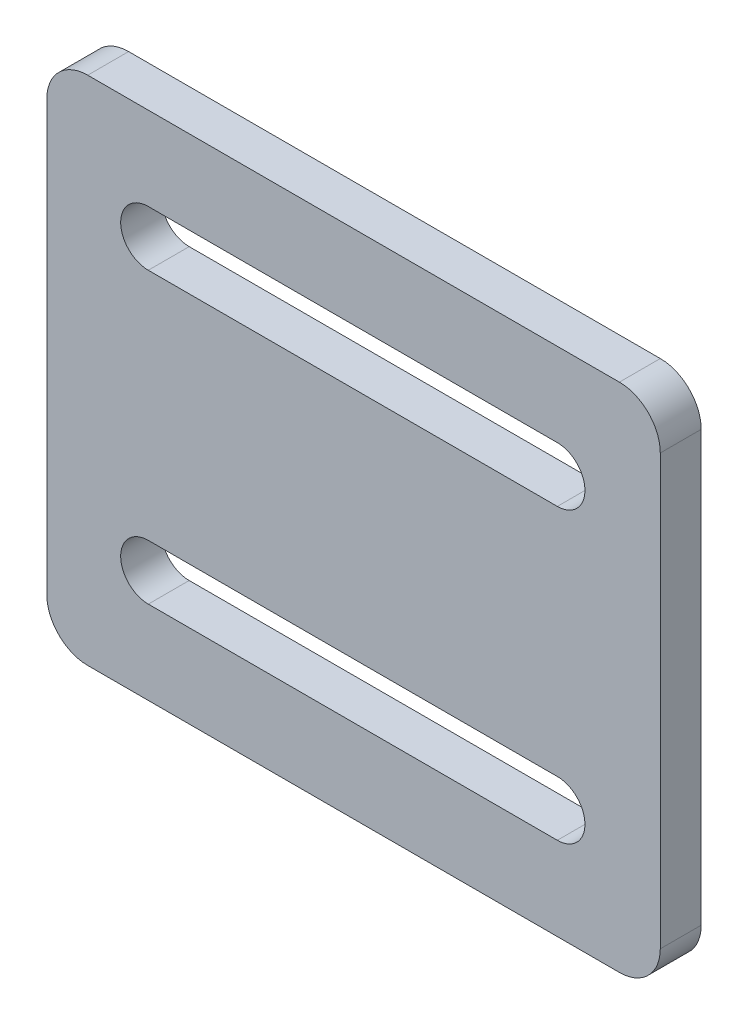
ISO-10303-21;
HEADER;
FILE_DESCRIPTION(('STEP AP214'),'2;1');
FILE_NAME('part.step','',(''),(''),'','','');
FILE_SCHEMA(('AUTOMOTIVE_DESIGN { 1 0 10303 214 1 1 1 1 }'));
ENDSEC;
DATA;
#1=APPLICATION_CONTEXT('core data for automotive mechanical design processes');
#2=APPLICATION_PROTOCOL_DEFINITION('international standard','automotive_design',2000,#1);
#3=PRODUCT_CONTEXT('',#1,'mechanical');
#4=PRODUCT('Part','Part','',(#3));
#5=PRODUCT_RELATED_PRODUCT_CATEGORY('part','',(#4));
#6=PRODUCT_DEFINITION_FORMATION('','',#4);
#7=PRODUCT_DEFINITION_CONTEXT('part definition',#1,'design');
#8=PRODUCT_DEFINITION('design','',#6,#7);
#9=PRODUCT_DEFINITION_SHAPE('','',#8);
#10=(LENGTH_UNIT() NAMED_UNIT(*) SI_UNIT(.MILLI.,.METRE.));
#11=(NAMED_UNIT(*) PLANE_ANGLE_UNIT() SI_UNIT($,.RADIAN.));
#12=(NAMED_UNIT(*) SI_UNIT($,.STERADIAN.) SOLID_ANGLE_UNIT());
#13=UNCERTAINTY_MEASURE_WITH_UNIT(LENGTH_MEASURE(1.E-05),#10,'distance_accuracy_value','');
#14=(GEOMETRIC_REPRESENTATION_CONTEXT(3) GLOBAL_UNCERTAINTY_ASSIGNED_CONTEXT((#13)) GLOBAL_UNIT_ASSIGNED_CONTEXT((#10,
#11,#12)) REPRESENTATION_CONTEXT('',''));
#15=CARTESIAN_POINT('',(0.,0.,0.));
#16=DIRECTION('',(0.,0.,1.));
#17=DIRECTION('',(1.,0.,0.));
#18=AXIS2_PLACEMENT_3D('',#15,#16,#17);
#19=CARTESIAN_POINT('',(-54.079318717369,30.4131067961165,2.));
#20=DIRECTION('',(0.,0.,1.));
#21=DIRECTION('',(1.,0.,0.));
#22=AXIS2_PLACEMENT_3D('',#19,#20,#21);
#23=PLANE('',#22);
#24=CARTESIAN_POINT('',(-54.079318717369,30.4131067961165,2.));
#25=DIRECTION('',(0.,0.,1.));
#26=DIRECTION('',(1.,0.,0.));
#27=AXIS2_PLACEMENT_3D('',#24,#25,#26);
#28=CIRCLE('',#27,2.);
#29=CARTESIAN_POINT('',(-54.079318717369,32.4131067961165,2.));
#30=VERTEX_POINT('',#29);
#31=CARTESIAN_POINT('',(-56.079318717369,30.4131067961165,2.));
#32=VERTEX_POINT('',#31);
#33=EDGE_CURVE('E228',#30,#32,#28,.T.);
#34=ORIENTED_EDGE('',*,*,#33,.T.);
#35=DIRECTION('',(0.,-1.,0.));
#36=VECTOR('',#35,1.);
#37=CARTESIAN_POINT('',(-56.079318717369,30.4131067961165,2.));
#38=LINE('',#37,#36);
#39=CARTESIAN_POINT('',(-56.079318717369,9.4131067961165,2.));
#40=VERTEX_POINT('',#39);
#41=EDGE_CURVE('E231',#32,#40,#38,.T.);
#42=ORIENTED_EDGE('',*,*,#41,.T.);
#43=CARTESIAN_POINT('',(-54.079318717369,9.4131067961165,2.));
#44=DIRECTION('',(0.,0.,1.));
#45=DIRECTION('',(1.,0.,0.));
#46=AXIS2_PLACEMENT_3D('',#43,#44,#45);
#47=CIRCLE('',#46,2.);
#48=CARTESIAN_POINT('',(-54.079318717369,7.4131067961165,2.));
#49=VERTEX_POINT('',#48);
#50=EDGE_CURVE('E234',#40,#49,#47,.T.);
#51=ORIENTED_EDGE('',*,*,#50,.T.);
#52=DIRECTION('',(1.,0.,0.));
#53=VECTOR('',#52,1.);
#54=CARTESIAN_POINT('',(-54.079318717369,7.4131067961165,2.));
#55=LINE('',#54,#53);
#56=CARTESIAN_POINT('',(-28.079318717369,7.4131067961165,2.));
#57=VERTEX_POINT('',#56);
#58=EDGE_CURVE('E236',#49,#57,#55,.T.);
#59=ORIENTED_EDGE('',*,*,#58,.T.);
#60=CARTESIAN_POINT('',(-28.079318717369,9.4131067961165,2.));
#61=DIRECTION('',(0.,0.,1.));
#62=DIRECTION('',(1.,0.,0.));
#63=AXIS2_PLACEMENT_3D('',#60,#61,#62);
#64=CIRCLE('',#63,2.);
#65=CARTESIAN_POINT('',(-26.079318717369,9.4131067961165,2.));
#66=VERTEX_POINT('',#65);
#67=EDGE_CURVE('E238',#57,#66,#64,.T.);
#68=ORIENTED_EDGE('',*,*,#67,.T.);
#69=DIRECTION('',(0.,1.,0.));
#70=VECTOR('',#69,1.);
#71=CARTESIAN_POINT('',(-26.079318717369,9.4131067961165,2.));
#72=LINE('',#71,#70);
#73=CARTESIAN_POINT('',(-26.079318717369,30.4131067961165,2.));
#74=VERTEX_POINT('',#73);
#75=EDGE_CURVE('E240',#66,#74,#72,.T.);
#76=ORIENTED_EDGE('',*,*,#75,.T.);
#77=CARTESIAN_POINT('',(-28.079318717369,30.4131067961165,2.));
#78=DIRECTION('',(0.,0.,1.));
#79=DIRECTION('',(1.,0.,0.));
#80=AXIS2_PLACEMENT_3D('',#77,#78,#79);
#81=CIRCLE('',#80,2.);
#82=CARTESIAN_POINT('',(-28.079318717369,32.4131067961165,2.));
#83=VERTEX_POINT('',#82);
#84=EDGE_CURVE('E242',#74,#83,#81,.T.);
#85=ORIENTED_EDGE('',*,*,#84,.T.);
#86=DIRECTION('',(-1.,0.,0.));
#87=VECTOR('',#86,1.);
#88=CARTESIAN_POINT('',(-28.079318717369,32.4131067961165,2.));
#89=LINE('',#88,#87);
#90=EDGE_CURVE('E244',#83,#30,#89,.T.);
#91=ORIENTED_EDGE('',*,*,#90,.T.);
#92=EDGE_LOOP('',(#34,#42,#51,#59,#68,#76,#85,#91));
#93=FACE_BOUND('',#92,.T.);
#94=DIRECTION('',(1.,0.,0.));
#95=VECTOR('',#94,1.);
#96=CARTESIAN_POINT('',(-51.1169778665467,25.6331067961165,2.));
#97=LINE('',#96,#95);
#98=CARTESIAN_POINT('',(-51.1169778665467,25.6331067961165,2.));
#99=VERTEX_POINT('',#98);
#100=CARTESIAN_POINT('',(-31.1137316402633,25.6331067961165,2.));
#101=VERTEX_POINT('',#100);
#102=EDGE_CURVE('E202',#99,#101,#97,.T.);
#103=ORIENTED_EDGE('',*,*,#102,.F.);
#104=CARTESIAN_POINT('',(-51.1169778665467,26.9831067961165,2.));
#105=DIRECTION('',(0.,0.,1.));
#106=DIRECTION('',(-1.,0.,0.));
#107=AXIS2_PLACEMENT_3D('',#104,#105,#106);
#108=ELLIPSE('',#107,1.35021912027413,1.35);
#109=CARTESIAN_POINT('',(-51.1169778665467,28.3331067961165,2.));
#110=VERTEX_POINT('',#109);
#111=EDGE_CURVE('E217',#110,#99,#108,.T.);
#112=ORIENTED_EDGE('',*,*,#111,.F.);
#113=DIRECTION('',(-1.,0.,0.));
#114=VECTOR('',#113,1.);
#115=CARTESIAN_POINT('',(-31.1137316402633,28.3331067961165,2.));
#116=LINE('',#115,#114);
#117=CARTESIAN_POINT('',(-31.1137316402633,28.3331067961165,2.));
#118=VERTEX_POINT('',#117);
#119=EDGE_CURVE('E201',#118,#110,#116,.T.);
#120=ORIENTED_EDGE('',*,*,#119,.F.);
#121=CARTESIAN_POINT('',(-31.1137316402633,26.9831067961165,2.));
#122=DIRECTION('',(0.,0.,1.));
#123=DIRECTION('',(-1.,0.,0.));
#124=AXIS2_PLACEMENT_3D('',#121,#122,#123);
#125=ELLIPSE('',#124,1.35021912027412,1.35);
#126=EDGE_CURVE('E196',#101,#118,#125,.T.);
#127=ORIENTED_EDGE('',*,*,#126,.F.);
#128=EDGE_LOOP('',(#103,#112,#120,#127));
#129=FACE_BOUND('',#128,.T.);
#130=DIRECTION('',(1.,0.,0.));
#131=VECTOR('',#130,1.);
#132=CARTESIAN_POINT('',(-51.1169778665467,11.4931067961165,2.));
#133=LINE('',#132,#131);
#134=CARTESIAN_POINT('',(-51.1169778665467,11.4931067961165,2.));
#135=VERTEX_POINT('',#134);
#136=CARTESIAN_POINT('',(-31.1137316402633,11.4931067961165,2.));
#137=VERTEX_POINT('',#136);
#138=EDGE_CURVE('E154',#135,#137,#133,.T.);
#139=ORIENTED_EDGE('',*,*,#138,.F.);
#140=CARTESIAN_POINT('',(-51.1169778665467,12.8431067961165,2.));
#141=DIRECTION('',(0.,0.,1.));
#142=DIRECTION('',(-1.,0.,0.));
#143=AXIS2_PLACEMENT_3D('',#140,#141,#142);
#144=ELLIPSE('',#143,1.35021912027413,1.35);
#145=CARTESIAN_POINT('',(-51.1169778665467,14.1931067961165,2.));
#146=VERTEX_POINT('',#145);
#147=EDGE_CURVE('E146',#146,#135,#144,.T.);
#148=ORIENTED_EDGE('',*,*,#147,.F.);
#149=DIRECTION('',(-1.,0.,0.));
#150=VECTOR('',#149,1.);
#151=CARTESIAN_POINT('',(-31.1137316402633,14.1931067961165,2.));
#152=LINE('',#151,#150);
#153=CARTESIAN_POINT('',(-31.1137316402633,14.1931067961165,2.));
#154=VERTEX_POINT('',#153);
#155=EDGE_CURVE('E168',#154,#146,#152,.T.);
#156=ORIENTED_EDGE('',*,*,#155,.F.);
#157=CARTESIAN_POINT('',(-31.1137316402633,12.8431067961165,2.));
#158=DIRECTION('',(0.,0.,1.));
#159=DIRECTION('',(-1.,0.,0.));
#160=AXIS2_PLACEMENT_3D('',#157,#158,#159);
#161=ELLIPSE('',#160,1.35021912027413,1.35);
#162=EDGE_CURVE('E166',#137,#154,#161,.T.);
#163=ORIENTED_EDGE('',*,*,#162,.F.);
#164=EDGE_LOOP('',(#139,#148,#156,#163));
#165=FACE_BOUND('',#164,.T.);
#166=ADVANCED_FACE('F33',(#93,#129,#165),#23,.T.);
#167=CARTESIAN_POINT('',(-54.079318717369,30.4131067961165,0.));
#168=DIRECTION('',(0.,0.,1.));
#169=DIRECTION('',(1.,0.,0.));
#170=AXIS2_PLACEMENT_3D('',#167,#168,#169);
#171=PLANE('',#170);
#172=CARTESIAN_POINT('',(-51.1169778665467,26.9831067961165,0.));
#173=DIRECTION('',(0.,0.,1.));
#174=DIRECTION('',(-1.,0.,0.));
#175=AXIS2_PLACEMENT_3D('',#172,#173,#174);
#176=ELLIPSE('',#175,1.35021912027413,1.35);
#177=CARTESIAN_POINT('',(-51.1169778665467,28.3331067961165,0.));
#178=VERTEX_POINT('',#177);
#179=CARTESIAN_POINT('',(-51.1169778665467,25.6331067961165,0.));
#180=VERTEX_POINT('',#179);
#181=EDGE_CURVE('E162',#178,#180,#176,.T.);
#182=ORIENTED_EDGE('',*,*,#181,.T.);
#183=DIRECTION('',(1.,0.,0.));
#184=VECTOR('',#183,1.);
#185=CARTESIAN_POINT('',(-51.1169778665467,25.6331067961165,0.));
#186=LINE('',#185,#184);
#187=CARTESIAN_POINT('',(-31.1137316402633,25.6331067961165,0.));
#188=VERTEX_POINT('',#187);
#189=EDGE_CURVE('E208',#180,#188,#186,.T.);
#190=ORIENTED_EDGE('',*,*,#189,.T.);
#191=CARTESIAN_POINT('',(-31.1137316402633,26.9831067961165,0.));
#192=DIRECTION('',(0.,0.,1.));
#193=DIRECTION('',(-1.,0.,0.));
#194=AXIS2_PLACEMENT_3D('',#191,#192,#193);
#195=ELLIPSE('',#194,1.35021912027412,1.35);
#196=CARTESIAN_POINT('',(-31.1137316402633,28.3331067961165,0.));
#197=VERTEX_POINT('',#196);
#198=EDGE_CURVE('E211',#188,#197,#195,.T.);
#199=ORIENTED_EDGE('',*,*,#198,.T.);
#200=DIRECTION('',(-1.,0.,0.));
#201=VECTOR('',#200,1.);
#202=CARTESIAN_POINT('',(-31.1137316402633,28.3331067961165,0.));
#203=LINE('',#202,#201);
#204=EDGE_CURVE('E214',#197,#178,#203,.T.);
#205=ORIENTED_EDGE('',*,*,#204,.T.);
#206=EDGE_LOOP('',(#182,#190,#199,#205));
#207=FACE_BOUND('',#206,.T.);
#208=CARTESIAN_POINT('',(-54.079318717369,30.4131067961165,0.));
#209=DIRECTION('',(0.,0.,1.));
#210=DIRECTION('',(1.,0.,0.));
#211=AXIS2_PLACEMENT_3D('',#208,#209,#210);
#212=CIRCLE('',#211,2.);
#213=CARTESIAN_POINT('',(-54.079318717369,32.4131067961165,0.));
#214=VERTEX_POINT('',#213);
#215=CARTESIAN_POINT('',(-56.079318717369,30.4131067961165,0.));
#216=VERTEX_POINT('',#215);
#217=EDGE_CURVE('E227',#214,#216,#212,.T.);
#218=ORIENTED_EDGE('',*,*,#217,.F.);
#219=DIRECTION('',(-1.,0.,0.));
#220=VECTOR('',#219,1.);
#221=CARTESIAN_POINT('',(-28.079318717369,32.4131067961165,0.));
#222=LINE('',#221,#220);
#223=CARTESIAN_POINT('',(-28.079318717369,32.4131067961165,0.));
#224=VERTEX_POINT('',#223);
#225=EDGE_CURVE('E232',#224,#214,#222,.T.);
#226=ORIENTED_EDGE('',*,*,#225,.F.);
#227=CARTESIAN_POINT('',(-28.079318717369,30.4131067961165,0.));
#228=DIRECTION('',(0.,0.,1.));
#229=DIRECTION('',(1.,0.,0.));
#230=AXIS2_PLACEMENT_3D('',#227,#228,#229);
#231=CIRCLE('',#230,2.);
#232=CARTESIAN_POINT('',(-26.079318717369,30.4131067961165,0.));
#233=VERTEX_POINT('',#232);
#234=EDGE_CURVE('E259',#233,#224,#231,.T.);
#235=ORIENTED_EDGE('',*,*,#234,.F.);
#236=DIRECTION('',(0.,1.,0.));
#237=VECTOR('',#236,1.);
#238=CARTESIAN_POINT('',(-26.079318717369,9.4131067961165,0.));
#239=LINE('',#238,#237);
#240=CARTESIAN_POINT('',(-26.079318717369,9.4131067961165,0.));
#241=VERTEX_POINT('',#240);
#242=EDGE_CURVE('E257',#241,#233,#239,.T.);
#243=ORIENTED_EDGE('',*,*,#242,.F.);
#244=CARTESIAN_POINT('',(-28.079318717369,9.4131067961165,0.));
#245=DIRECTION('',(0.,0.,1.));
#246=DIRECTION('',(1.,0.,0.));
#247=AXIS2_PLACEMENT_3D('',#244,#245,#246);
#248=CIRCLE('',#247,2.);
#249=CARTESIAN_POINT('',(-28.079318717369,7.4131067961165,0.));
#250=VERTEX_POINT('',#249);
#251=EDGE_CURVE('E255',#250,#241,#248,.T.);
#252=ORIENTED_EDGE('',*,*,#251,.F.);
#253=DIRECTION('',(1.,0.,0.));
#254=VECTOR('',#253,1.);
#255=CARTESIAN_POINT('',(-54.079318717369,7.4131067961165,0.));
#256=LINE('',#255,#254);
#257=CARTESIAN_POINT('',(-54.079318717369,7.4131067961165,0.));
#258=VERTEX_POINT('',#257);
#259=EDGE_CURVE('E253',#258,#250,#256,.T.);
#260=ORIENTED_EDGE('',*,*,#259,.F.);
#261=CARTESIAN_POINT('',(-54.079318717369,9.4131067961165,0.));
#262=DIRECTION('',(0.,0.,1.));
#263=DIRECTION('',(1.,0.,0.));
#264=AXIS2_PLACEMENT_3D('',#261,#262,#263);
#265=CIRCLE('',#264,2.);
#266=CARTESIAN_POINT('',(-56.079318717369,9.4131067961165,0.));
#267=VERTEX_POINT('',#266);
#268=EDGE_CURVE('E251',#267,#258,#265,.T.);
#269=ORIENTED_EDGE('',*,*,#268,.F.);
#270=DIRECTION('',(0.,-1.,0.));
#271=VECTOR('',#270,1.);
#272=CARTESIAN_POINT('',(-56.079318717369,30.4131067961165,0.));
#273=LINE('',#272,#271);
#274=EDGE_CURVE('E249',#216,#267,#273,.T.);
#275=ORIENTED_EDGE('',*,*,#274,.F.);
#276=EDGE_LOOP('',(#218,#226,#235,#243,#252,#260,#269,#275));
#277=FACE_BOUND('',#276,.T.);
#278=CARTESIAN_POINT('',(-51.1169778665467,12.8431067961165,0.));
#279=DIRECTION('',(0.,0.,1.));
#280=DIRECTION('',(-1.,0.,0.));
#281=AXIS2_PLACEMENT_3D('',#278,#279,#280);
#282=ELLIPSE('',#281,1.35021912027413,1.35);
#283=CARTESIAN_POINT('',(-51.1169778665467,14.1931067961165,0.));
#284=VERTEX_POINT('',#283);
#285=CARTESIAN_POINT('',(-51.1169778665467,11.4931067961165,0.));
#286=VERTEX_POINT('',#285);
#287=EDGE_CURVE('E56',#284,#286,#282,.T.);
#288=ORIENTED_EDGE('',*,*,#287,.T.);
#289=DIRECTION('',(1.,0.,0.));
#290=VECTOR('',#289,1.);
#291=CARTESIAN_POINT('',(-51.1169778665467,11.4931067961165,0.));
#292=LINE('',#291,#290);
#293=CARTESIAN_POINT('',(-31.1137316402633,11.4931067961165,0.));
#294=VERTEX_POINT('',#293);
#295=EDGE_CURVE('E161',#286,#294,#292,.T.);
#296=ORIENTED_EDGE('',*,*,#295,.T.);
#297=CARTESIAN_POINT('',(-31.1137316402633,12.8431067961165,0.));
#298=DIRECTION('',(0.,0.,1.));
#299=DIRECTION('',(-1.,0.,0.));
#300=AXIS2_PLACEMENT_3D('',#297,#298,#299);
#301=ELLIPSE('',#300,1.35021912027413,1.35);
#302=CARTESIAN_POINT('',(-31.1137316402633,14.1931067961165,0.));
#303=VERTEX_POINT('',#302);
#304=EDGE_CURVE('E363',#294,#303,#301,.T.);
#305=ORIENTED_EDGE('',*,*,#304,.T.);
#306=DIRECTION('',(-1.,0.,0.));
#307=VECTOR('',#306,1.);
#308=CARTESIAN_POINT('',(-31.1137316402633,14.1931067961165,0.));
#309=LINE('',#308,#307);
#310=EDGE_CURVE('E155',#303,#284,#309,.T.);
#311=ORIENTED_EDGE('',*,*,#310,.T.);
#312=EDGE_LOOP('',(#288,#296,#305,#311));
#313=FACE_BOUND('',#312,.T.);
#314=ADVANCED_FACE('F289',(#207,#277,#313),#171,.F.);
#315=CARTESIAN_POINT('',(-54.079318717369,30.4131067961165,2.));
#316=DIRECTION('',(0.,0.,-1.));
#317=DIRECTION('',(-1.,0.,0.));
#318=AXIS2_PLACEMENT_3D('',#315,#316,#317);
#319=CYLINDRICAL_SURFACE('',#318,2.);
#320=ORIENTED_EDGE('',*,*,#217,.T.);
#321=DIRECTION('',(0.,0.,-1.));
#322=VECTOR('',#321,1.);
#323=CARTESIAN_POINT('',(-56.079318717369,30.4131067961165,2.));
#324=LINE('',#323,#322);
#325=EDGE_CURVE('E11',#32,#216,#324,.T.);
#326=ORIENTED_EDGE('',*,*,#325,.F.);
#327=ORIENTED_EDGE('',*,*,#33,.F.);
#328=DIRECTION('',(0.,0.,-1.));
#329=VECTOR('',#328,1.);
#330=CARTESIAN_POINT('',(-54.079318717369,32.4131067961165,2.));
#331=LINE('',#330,#329);
#332=EDGE_CURVE('E246',#30,#214,#331,.T.);
#333=ORIENTED_EDGE('',*,*,#332,.T.);
#334=EDGE_LOOP('',(#320,#326,#327,#333));
#335=FACE_BOUND('',#334,.T.);
#336=ADVANCED_FACE('F35',(#335),#319,.T.);
#337=CARTESIAN_POINT('',(-56.079318717369,30.4131067961165,2.));
#338=DIRECTION('',(1.,0.,0.));
#339=DIRECTION('',(0.,0.,-1.));
#340=AXIS2_PLACEMENT_3D('',#337,#338,#339);
#341=PLANE('',#340);
#342=ORIENTED_EDGE('',*,*,#274,.T.);
#343=DIRECTION('',(0.,0.,-1.));
#344=VECTOR('',#343,1.);
#345=CARTESIAN_POINT('',(-56.079318717369,9.4131067961165,2.));
#346=LINE('',#345,#344);
#347=EDGE_CURVE('E41',#40,#267,#346,.T.);
#348=ORIENTED_EDGE('',*,*,#347,.F.);
#349=ORIENTED_EDGE('',*,*,#41,.F.);
#350=ORIENTED_EDGE('',*,*,#325,.T.);
#351=EDGE_LOOP('',(#342,#348,#349,#350));
#352=FACE_BOUND('',#351,.T.);
#353=ADVANCED_FACE('F307',(#352),#341,.F.);
#354=CARTESIAN_POINT('',(-54.079318717369,9.4131067961165,2.));
#355=DIRECTION('',(0.,0.,-1.));
#356=DIRECTION('',(-1.,0.,0.));
#357=AXIS2_PLACEMENT_3D('',#354,#355,#356);
#358=CYLINDRICAL_SURFACE('',#357,2.);
#359=ORIENTED_EDGE('',*,*,#268,.T.);
#360=DIRECTION('',(0.,0.,-1.));
#361=VECTOR('',#360,1.);
#362=CARTESIAN_POINT('',(-54.079318717369,7.4131067961165,2.));
#363=LINE('',#362,#361);
#364=EDGE_CURVE('E276',#49,#258,#363,.T.);
#365=ORIENTED_EDGE('',*,*,#364,.F.);
#366=ORIENTED_EDGE('',*,*,#50,.F.);
#367=ORIENTED_EDGE('',*,*,#347,.T.);
#368=EDGE_LOOP('',(#359,#365,#366,#367));
#369=FACE_BOUND('',#368,.T.);
#370=ADVANCED_FACE('F283',(#369),#358,.T.);
#371=CARTESIAN_POINT('',(-54.079318717369,7.4131067961165,2.));
#372=DIRECTION('',(0.,1.,0.));
#373=DIRECTION('',(0.,0.,1.));
#374=AXIS2_PLACEMENT_3D('',#371,#372,#373);
#375=PLANE('',#374);
#376=ORIENTED_EDGE('',*,*,#259,.T.);
#377=DIRECTION('',(0.,0.,-1.));
#378=VECTOR('',#377,1.);
#379=CARTESIAN_POINT('',(-28.079318717369,7.4131067961165,2.));
#380=LINE('',#379,#378);
#381=EDGE_CURVE('E273',#57,#250,#380,.T.);
#382=ORIENTED_EDGE('',*,*,#381,.F.);
#383=ORIENTED_EDGE('',*,*,#58,.F.);
#384=ORIENTED_EDGE('',*,*,#364,.T.);
#385=EDGE_LOOP('',(#376,#382,#383,#384));
#386=FACE_BOUND('',#385,.T.);
#387=ADVANCED_FACE('F295',(#386),#375,.F.);
#388=CARTESIAN_POINT('',(-28.079318717369,9.4131067961165,2.));
#389=DIRECTION('',(0.,0.,-1.));
#390=DIRECTION('',(-1.,0.,0.));
#391=AXIS2_PLACEMENT_3D('',#388,#389,#390);
#392=CYLINDRICAL_SURFACE('',#391,2.);
#393=ORIENTED_EDGE('',*,*,#251,.T.);
#394=DIRECTION('',(0.,0.,-1.));
#395=VECTOR('',#394,1.);
#396=CARTESIAN_POINT('',(-26.079318717369,9.4131067961165,2.));
#397=LINE('',#396,#395);
#398=EDGE_CURVE('E270',#66,#241,#397,.T.);
#399=ORIENTED_EDGE('',*,*,#398,.F.);
#400=ORIENTED_EDGE('',*,*,#67,.F.);
#401=ORIENTED_EDGE('',*,*,#381,.T.);
#402=EDGE_LOOP('',(#393,#399,#400,#401));
#403=FACE_BOUND('',#402,.T.);
#404=ADVANCED_FACE('F299',(#403),#392,.T.);
#405=CARTESIAN_POINT('',(-26.079318717369,9.4131067961165,2.));
#406=DIRECTION('',(-1.,0.,0.));
#407=DIRECTION('',(0.,-1.,0.));
#408=AXIS2_PLACEMENT_3D('',#405,#406,#407);
#409=PLANE('',#408);
#410=ORIENTED_EDGE('',*,*,#242,.T.);
#411=DIRECTION('',(0.,0.,-1.));
#412=VECTOR('',#411,1.);
#413=CARTESIAN_POINT('',(-26.079318717369,30.4131067961165,2.));
#414=LINE('',#413,#412);
#415=EDGE_CURVE('E267',#74,#233,#414,.T.);
#416=ORIENTED_EDGE('',*,*,#415,.F.);
#417=ORIENTED_EDGE('',*,*,#75,.F.);
#418=ORIENTED_EDGE('',*,*,#398,.T.);
#419=EDGE_LOOP('',(#410,#416,#417,#418));
#420=FACE_BOUND('',#419,.T.);
#421=ADVANCED_FACE('F320',(#420),#409,.F.);
#422=CARTESIAN_POINT('',(-28.079318717369,30.4131067961165,2.));
#423=DIRECTION('',(0.,0.,-1.));
#424=DIRECTION('',(-1.,0.,0.));
#425=AXIS2_PLACEMENT_3D('',#422,#423,#424);
#426=CYLINDRICAL_SURFACE('',#425,2.);
#427=ORIENTED_EDGE('',*,*,#234,.T.);
#428=DIRECTION('',(0.,0.,-1.));
#429=VECTOR('',#428,1.);
#430=CARTESIAN_POINT('',(-28.079318717369,32.4131067961165,2.));
#431=LINE('',#430,#429);
#432=EDGE_CURVE('E264',#83,#224,#431,.T.);
#433=ORIENTED_EDGE('',*,*,#432,.F.);
#434=ORIENTED_EDGE('',*,*,#84,.F.);
#435=ORIENTED_EDGE('',*,*,#415,.T.);
#436=EDGE_LOOP('',(#427,#433,#434,#435));
#437=FACE_BOUND('',#436,.T.);
#438=ADVANCED_FACE('F318',(#437),#426,.T.);
#439=CARTESIAN_POINT('',(-28.079318717369,32.4131067961165,2.));
#440=DIRECTION('',(0.,-1.,0.));
#441=DIRECTION('',(0.,0.,-1.));
#442=AXIS2_PLACEMENT_3D('',#439,#440,#441);
#443=PLANE('',#442);
#444=ORIENTED_EDGE('',*,*,#225,.T.);
#445=ORIENTED_EDGE('',*,*,#332,.F.);
#446=ORIENTED_EDGE('',*,*,#90,.F.);
#447=ORIENTED_EDGE('',*,*,#432,.T.);
#448=EDGE_LOOP('',(#444,#445,#446,#447));
#449=FACE_BOUND('',#448,.T.);
#450=ADVANCED_FACE('F313',(#449),#443,.F.);
#451=DIRECTION('',(0.,0.,-1.));
#452=VECTOR('',#451,1.);
#453=SURFACE_OF_LINEAR_EXTRUSION('',#108,#452);
#454=ORIENTED_EDGE('',*,*,#181,.F.);
#455=DIRECTION('',(0.,0.,-1.));
#456=VECTOR('',#455,1.);
#457=CARTESIAN_POINT('',(-51.1169778665467,28.3331067961165,2.));
#458=LINE('',#457,#456);
#459=EDGE_CURVE('E205',#110,#178,#458,.T.);
#460=ORIENTED_EDGE('',*,*,#459,.F.);
#461=ORIENTED_EDGE('',*,*,#111,.T.);
#462=DIRECTION('',(0.,0.,-1.));
#463=VECTOR('',#462,1.);
#464=CARTESIAN_POINT('',(-51.1169778665467,25.6331067961165,2.));
#465=LINE('',#464,#463);
#466=EDGE_CURVE('E224',#99,#180,#465,.T.);
#467=ORIENTED_EDGE('',*,*,#466,.T.);
#468=EDGE_LOOP('',(#454,#460,#461,#467));
#469=FACE_BOUND('',#468,.T.);
#470=ADVANCED_FACE('F336',(#469),#453,.T.);
#471=CARTESIAN_POINT('',(-51.1169778665467,25.6331067961165,2.));
#472=DIRECTION('',(0.,1.,0.));
#473=DIRECTION('',(0.,0.,1.));
#474=AXIS2_PLACEMENT_3D('',#471,#472,#473);
#475=PLANE('',#474);
#476=ORIENTED_EDGE('',*,*,#189,.F.);
#477=ORIENTED_EDGE('',*,*,#466,.F.);
#478=ORIENTED_EDGE('',*,*,#102,.T.);
#479=DIRECTION('',(0.,0.,-1.));
#480=VECTOR('',#479,1.);
#481=CARTESIAN_POINT('',(-31.1137316402633,25.6331067961165,2.));
#482=LINE('',#481,#480);
#483=EDGE_CURVE('E222',#101,#188,#482,.T.);
#484=ORIENTED_EDGE('',*,*,#483,.T.);
#485=EDGE_LOOP('',(#476,#477,#478,#484));
#486=FACE_BOUND('',#485,.T.);
#487=ADVANCED_FACE('F193',(#486),#475,.T.);
#488=DIRECTION('',(0.,0.,-1.));
#489=VECTOR('',#488,1.);
#490=SURFACE_OF_LINEAR_EXTRUSION('',#125,#489);
#491=ORIENTED_EDGE('',*,*,#198,.F.);
#492=ORIENTED_EDGE('',*,*,#483,.F.);
#493=ORIENTED_EDGE('',*,*,#126,.T.);
#494=DIRECTION('',(0.,0.,-1.));
#495=VECTOR('',#494,1.);
#496=CARTESIAN_POINT('',(-31.1137316402633,28.3331067961165,2.));
#497=LINE('',#496,#495);
#498=EDGE_CURVE('E220',#118,#197,#497,.T.);
#499=ORIENTED_EDGE('',*,*,#498,.T.);
#500=EDGE_LOOP('',(#491,#492,#493,#499));
#501=FACE_BOUND('',#500,.T.);
#502=ADVANCED_FACE('F188',(#501),#490,.T.);
#503=CARTESIAN_POINT('',(-31.1137316402633,28.3331067961165,2.));
#504=DIRECTION('',(0.,-1.,0.));
#505=DIRECTION('',(1.,0.,0.));
#506=AXIS2_PLACEMENT_3D('',#503,#504,#505);
#507=PLANE('',#506);
#508=ORIENTED_EDGE('',*,*,#204,.F.);
#509=ORIENTED_EDGE('',*,*,#498,.F.);
#510=ORIENTED_EDGE('',*,*,#119,.T.);
#511=ORIENTED_EDGE('',*,*,#459,.T.);
#512=EDGE_LOOP('',(#508,#509,#510,#511));
#513=FACE_BOUND('',#512,.T.);
#514=ADVANCED_FACE('F185',(#513),#507,.T.);
#515=DIRECTION('',(0.,0.,-1.));
#516=VECTOR('',#515,1.);
#517=SURFACE_OF_LINEAR_EXTRUSION('',#144,#516);
#518=ORIENTED_EDGE('',*,*,#287,.F.);
#519=DIRECTION('',(0.,0.,-1.));
#520=VECTOR('',#519,1.);
#521=CARTESIAN_POINT('',(-51.1169778665467,14.1931067961165,2.));
#522=LINE('',#521,#520);
#523=EDGE_CURVE('E150',#146,#284,#522,.T.);
#524=ORIENTED_EDGE('',*,*,#523,.F.);
#525=ORIENTED_EDGE('',*,*,#147,.T.);
#526=DIRECTION('',(0.,0.,-1.));
#527=VECTOR('',#526,1.);
#528=CARTESIAN_POINT('',(-51.1169778665467,11.4931067961165,2.));
#529=LINE('',#528,#527);
#530=EDGE_CURVE('E149',#135,#286,#529,.T.);
#531=ORIENTED_EDGE('',*,*,#530,.T.);
#532=EDGE_LOOP('',(#518,#524,#525,#531));
#533=FACE_BOUND('',#532,.T.);
#534=ADVANCED_FACE('F148',(#533),#517,.T.);
#535=CARTESIAN_POINT('',(-51.1169778665467,11.4931067961165,2.));
#536=DIRECTION('',(0.,1.,0.));
#537=DIRECTION('',(-1.,0.,0.));
#538=AXIS2_PLACEMENT_3D('',#535,#536,#537);
#539=PLANE('',#538);
#540=ORIENTED_EDGE('',*,*,#295,.F.);
#541=ORIENTED_EDGE('',*,*,#530,.F.);
#542=ORIENTED_EDGE('',*,*,#138,.T.);
#543=DIRECTION('',(0.,0.,-1.));
#544=VECTOR('',#543,1.);
#545=CARTESIAN_POINT('',(-31.1137316402633,11.4931067961165,2.));
#546=LINE('',#545,#544);
#547=EDGE_CURVE('E163',#137,#294,#546,.T.);
#548=ORIENTED_EDGE('',*,*,#547,.T.);
#549=EDGE_LOOP('',(#540,#541,#542,#548));
#550=FACE_BOUND('',#549,.T.);
#551=ADVANCED_FACE('F158',(#550),#539,.T.);
#552=DIRECTION('',(0.,0.,-1.));
#553=VECTOR('',#552,1.);
#554=SURFACE_OF_LINEAR_EXTRUSION('',#161,#553);
#555=ORIENTED_EDGE('',*,*,#304,.F.);
#556=ORIENTED_EDGE('',*,*,#547,.F.);
#557=ORIENTED_EDGE('',*,*,#162,.T.);
#558=DIRECTION('',(0.,0.,-1.));
#559=VECTOR('',#558,1.);
#560=CARTESIAN_POINT('',(-31.1137316402633,14.1931067961165,2.));
#561=LINE('',#560,#559);
#562=EDGE_CURVE('E48',#154,#303,#561,.T.);
#563=ORIENTED_EDGE('',*,*,#562,.T.);
#564=EDGE_LOOP('',(#555,#556,#557,#563));
#565=FACE_BOUND('',#564,.T.);
#566=ADVANCED_FACE('F175',(#565),#554,.T.);
#567=CARTESIAN_POINT('',(-31.1137316402633,14.1931067961165,2.));
#568=DIRECTION('',(0.,-1.,0.));
#569=DIRECTION('',(1.,0.,0.));
#570=AXIS2_PLACEMENT_3D('',#567,#568,#569);
#571=PLANE('',#570);
#572=ORIENTED_EDGE('',*,*,#310,.F.);
#573=ORIENTED_EDGE('',*,*,#562,.F.);
#574=ORIENTED_EDGE('',*,*,#155,.T.);
#575=ORIENTED_EDGE('',*,*,#523,.T.);
#576=EDGE_LOOP('',(#572,#573,#574,#575));
#577=FACE_BOUND('',#576,.T.);
#578=ADVANCED_FACE('F179',(#577),#571,.T.);
#579=CLOSED_SHELL('',(#166,#314,#336,#353,#370,#387,#404,#421,#438,#450,#470,#487,#502,#514,
#534,#551,#566,#578));
#580=MANIFOLD_SOLID_BREP('B2',#579);
#581=ADVANCED_BREP_SHAPE_REPRESENTATION('',(#18,#580),#14);
#582=SHAPE_DEFINITION_REPRESENTATION(#9,#581);
ENDSEC;
END-ISO-10303-21;
